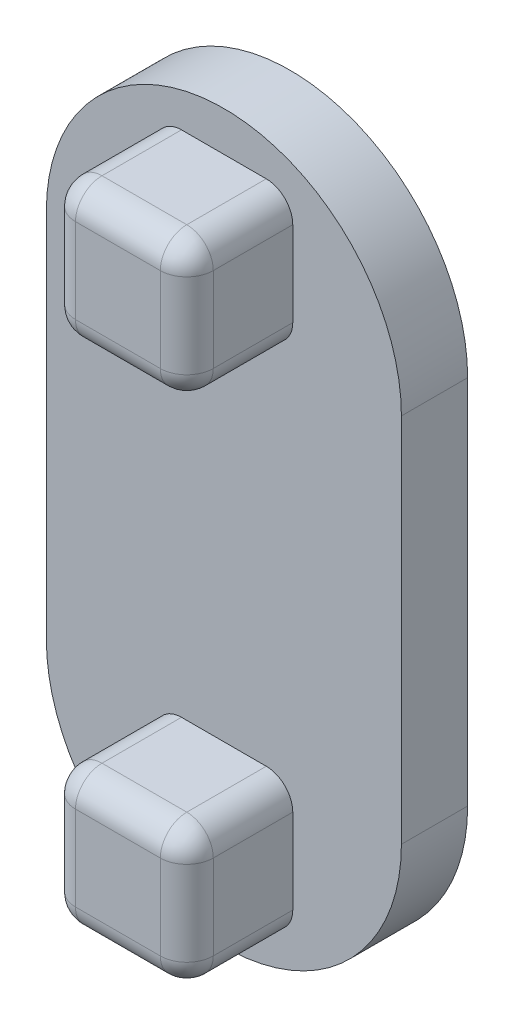
ISO-10303-21;
HEADER;
FILE_DESCRIPTION(('STEP AP214'),'2;1');
FILE_NAME('part.step','',(''),(''),'','','');
FILE_SCHEMA(('AUTOMOTIVE_DESIGN { 1 0 10303 214 1 1 1 1 }'));
ENDSEC;
DATA;
#1=APPLICATION_CONTEXT('core data for automotive mechanical design processes');
#2=APPLICATION_PROTOCOL_DEFINITION('international standard','automotive_design',2000,#1);
#3=PRODUCT_CONTEXT('',#1,'mechanical');
#4=PRODUCT('Part','Part','',(#3));
#5=PRODUCT_RELATED_PRODUCT_CATEGORY('part','',(#4));
#6=PRODUCT_DEFINITION_FORMATION('','',#4);
#7=PRODUCT_DEFINITION_CONTEXT('part definition',#1,'design');
#8=PRODUCT_DEFINITION('design','',#6,#7);
#9=PRODUCT_DEFINITION_SHAPE('','',#8);
#10=(LENGTH_UNIT() NAMED_UNIT(*) SI_UNIT(.MILLI.,.METRE.));
#11=(NAMED_UNIT(*) PLANE_ANGLE_UNIT() SI_UNIT($,.RADIAN.));
#12=(NAMED_UNIT(*) SI_UNIT($,.STERADIAN.) SOLID_ANGLE_UNIT());
#13=UNCERTAINTY_MEASURE_WITH_UNIT(LENGTH_MEASURE(1.E-05),#10,'distance_accuracy_value','');
#14=(GEOMETRIC_REPRESENTATION_CONTEXT(3) GLOBAL_UNCERTAINTY_ASSIGNED_CONTEXT((#13)) GLOBAL_UNIT_ASSIGNED_CONTEXT((#10,
#11,#12)) REPRESENTATION_CONTEXT('',''));
#15=CARTESIAN_POINT('',(0.,0.,0.));
#16=DIRECTION('',(0.,0.,1.));
#17=DIRECTION('',(1.,0.,0.));
#18=AXIS2_PLACEMENT_3D('',#15,#16,#17);
#19=CARTESIAN_POINT('',(0.,0.,2.5));
#20=DIRECTION('',(0.,0.,1.));
#21=DIRECTION('',(1.,0.,0.));
#22=AXIS2_PLACEMENT_3D('',#19,#20,#21);
#23=PLANE('',#22);
#24=CARTESIAN_POINT('',(0.,0.,2.5));
#25=DIRECTION('',(0.,0.,1.));
#26=DIRECTION('',(1.,0.,0.));
#27=AXIS2_PLACEMENT_3D('',#24,#25,#26);
#28=CIRCLE('',#27,6.7);
#29=CARTESIAN_POINT('',(-6.7,0.,2.5));
#30=VERTEX_POINT('',#29);
#31=CARTESIAN_POINT('',(6.7,0.,2.5));
#32=VERTEX_POINT('',#31);
#33=EDGE_CURVE('E220',#30,#32,#28,.T.);
#34=ORIENTED_EDGE('',*,*,#33,.T.);
#35=DIRECTION('',(0.,1.,0.));
#36=VECTOR('',#35,1.);
#37=CARTESIAN_POINT('',(6.7,0.,2.5));
#38=LINE('',#37,#36);
#39=CARTESIAN_POINT('',(6.7,14.,2.5));
#40=VERTEX_POINT('',#39);
#41=EDGE_CURVE('E208',#32,#40,#38,.T.);
#42=ORIENTED_EDGE('',*,*,#41,.T.);
#43=CARTESIAN_POINT('',(0.,14.,2.5));
#44=DIRECTION('',(0.,0.,1.));
#45=DIRECTION('',(1.,0.,0.));
#46=AXIS2_PLACEMENT_3D('',#43,#44,#45);
#47=CIRCLE('',#46,6.7);
#48=CARTESIAN_POINT('',(-6.7,14.,2.5));
#49=VERTEX_POINT('',#48);
#50=EDGE_CURVE('E219',#40,#49,#47,.T.);
#51=ORIENTED_EDGE('',*,*,#50,.T.);
#52=DIRECTION('',(0.,-1.,0.));
#53=VECTOR('',#52,1.);
#54=CARTESIAN_POINT('',(-6.7,0.,2.5));
#55=LINE('',#54,#53);
#56=EDGE_CURVE('E225',#49,#30,#55,.T.);
#57=ORIENTED_EDGE('',*,*,#56,.T.);
#58=EDGE_LOOP('',(#34,#42,#51,#57));
#59=FACE_BOUND('',#58,.T.);
#60=DIRECTION('',(0.,1.,0.));
#61=VECTOR('',#60,1.);
#62=CARTESIAN_POINT('',(2.6,14.,2.5));
#63=LINE('',#62,#61);
#64=CARTESIAN_POINT('',(2.6,15.,2.5));
#65=VERTEX_POINT('',#64);
#66=CARTESIAN_POINT('',(2.6,18.2,2.5));
#67=VERTEX_POINT('',#66);
#68=EDGE_CURVE('E486',#65,#67,#63,.T.);
#69=ORIENTED_EDGE('',*,*,#68,.F.);
#70=CARTESIAN_POINT('',(1.6,15.,2.5));
#71=DIRECTION('',(0.,0.,1.));
#72=DIRECTION('',(1.,0.,0.));
#73=AXIS2_PLACEMENT_3D('',#70,#71,#72);
#74=CIRCLE('',#73,1.);
#75=CARTESIAN_POINT('',(1.6,14.,2.5));
#76=VERTEX_POINT('',#75);
#77=EDGE_CURVE('E340',#65,#76,#74,.F.);
#78=ORIENTED_EDGE('',*,*,#77,.T.);
#79=DIRECTION('',(1.,0.,0.));
#80=VECTOR('',#79,1.);
#81=CARTESIAN_POINT('',(-2.6,14.,2.5));
#82=LINE('',#81,#80);
#83=CARTESIAN_POINT('',(-1.6,14.,2.5));
#84=VERTEX_POINT('',#83);
#85=EDGE_CURVE('E484',#84,#76,#82,.T.);
#86=ORIENTED_EDGE('',*,*,#85,.F.);
#87=CARTESIAN_POINT('',(-1.6,15.,2.5));
#88=DIRECTION('',(0.,0.,1.));
#89=DIRECTION('',(1.,0.,0.));
#90=AXIS2_PLACEMENT_3D('',#87,#88,#89);
#91=CIRCLE('',#90,1.);
#92=CARTESIAN_POINT('',(-2.6,15.,2.5));
#93=VERTEX_POINT('',#92);
#94=EDGE_CURVE('E349',#84,#93,#91,.F.);
#95=ORIENTED_EDGE('',*,*,#94,.T.);
#96=DIRECTION('',(0.,-1.,0.));
#97=VECTOR('',#96,1.);
#98=CARTESIAN_POINT('',(-2.6,14.,2.5));
#99=LINE('',#98,#97);
#100=CARTESIAN_POINT('',(-2.6,18.2,2.5));
#101=VERTEX_POINT('',#100);
#102=EDGE_CURVE('E406',#101,#93,#99,.T.);
#103=ORIENTED_EDGE('',*,*,#102,.F.);
#104=CARTESIAN_POINT('',(-1.6,18.2,2.5));
#105=DIRECTION('',(0.,0.,1.));
#106=DIRECTION('',(1.,0.,0.));
#107=AXIS2_PLACEMENT_3D('',#104,#105,#106);
#108=CIRCLE('',#107,1.);
#109=CARTESIAN_POINT('',(-1.6,19.2,2.5));
#110=VERTEX_POINT('',#109);
#111=EDGE_CURVE('E346',#101,#110,#108,.F.);
#112=ORIENTED_EDGE('',*,*,#111,.T.);
#113=DIRECTION('',(-1.,0.,0.));
#114=VECTOR('',#113,1.);
#115=CARTESIAN_POINT('',(-2.6,19.2,2.5));
#116=LINE('',#115,#114);
#117=CARTESIAN_POINT('',(1.6,19.2,2.5));
#118=VERTEX_POINT('',#117);
#119=EDGE_CURVE('E496',#118,#110,#116,.T.);
#120=ORIENTED_EDGE('',*,*,#119,.F.);
#121=CARTESIAN_POINT('',(1.6,18.2,2.5));
#122=DIRECTION('',(0.,0.,1.));
#123=DIRECTION('',(1.,0.,0.));
#124=AXIS2_PLACEMENT_3D('',#121,#122,#123);
#125=CIRCLE('',#124,1.);
#126=EDGE_CURVE('E343',#118,#67,#125,.F.);
#127=ORIENTED_EDGE('',*,*,#126,.T.);
#128=EDGE_LOOP('',(#69,#78,#86,#95,#103,#112,#120,#127));
#129=FACE_BOUND('',#128,.T.);
#130=DIRECTION('',(1.,0.,0.));
#131=VECTOR('',#130,1.);
#132=CARTESIAN_POINT('',(-2.6,-5.2,2.5));
#133=LINE('',#132,#131);
#134=CARTESIAN_POINT('',(-1.6,-5.2,2.5));
#135=VERTEX_POINT('',#134);
#136=CARTESIAN_POINT('',(1.6,-5.2,2.5));
#137=VERTEX_POINT('',#136);
#138=EDGE_CURVE('E494',#135,#137,#133,.T.);
#139=ORIENTED_EDGE('',*,*,#138,.F.);
#140=CARTESIAN_POINT('',(-1.6,-4.2,2.5));
#141=DIRECTION('',(0.,0.,1.));
#142=DIRECTION('',(1.,0.,0.));
#143=AXIS2_PLACEMENT_3D('',#140,#141,#142);
#144=CIRCLE('',#143,1.);
#145=CARTESIAN_POINT('',(-2.6,-4.2,2.5));
#146=VERTEX_POINT('',#145);
#147=EDGE_CURVE('E11',#135,#146,#144,.F.);
#148=ORIENTED_EDGE('',*,*,#147,.T.);
#149=DIRECTION('',(0.,-1.,0.));
#150=VECTOR('',#149,1.);
#151=CARTESIAN_POINT('',(-2.6,0.,2.5));
#152=LINE('',#151,#150);
#153=CARTESIAN_POINT('',(-2.6,-1.,2.5));
#154=VERTEX_POINT('',#153);
#155=EDGE_CURVE('E489',#154,#146,#152,.T.);
#156=ORIENTED_EDGE('',*,*,#155,.F.);
#157=CARTESIAN_POINT('',(-1.6,-1.,2.5));
#158=DIRECTION('',(0.,0.,1.));
#159=DIRECTION('',(1.,0.,0.));
#160=AXIS2_PLACEMENT_3D('',#157,#158,#159);
#161=CIRCLE('',#160,1.);
#162=CARTESIAN_POINT('',(-1.6,0.,2.5));
#163=VERTEX_POINT('',#162);
#164=EDGE_CURVE('E355',#154,#163,#161,.F.);
#165=ORIENTED_EDGE('',*,*,#164,.T.);
#166=DIRECTION('',(-1.,0.,0.));
#167=VECTOR('',#166,1.);
#168=CARTESIAN_POINT('',(-2.6,0.,2.5));
#169=LINE('',#168,#167);
#170=CARTESIAN_POINT('',(1.6,0.,2.5));
#171=VERTEX_POINT('',#170);
#172=EDGE_CURVE('E508',#171,#163,#169,.T.);
#173=ORIENTED_EDGE('',*,*,#172,.F.);
#174=CARTESIAN_POINT('',(1.6,-1.,2.5));
#175=DIRECTION('',(0.,0.,1.));
#176=DIRECTION('',(1.,0.,0.));
#177=AXIS2_PLACEMENT_3D('',#174,#175,#176);
#178=CIRCLE('',#177,1.);
#179=CARTESIAN_POINT('',(2.6,-1.,2.5));
#180=VERTEX_POINT('',#179);
#181=EDGE_CURVE('E352',#171,#180,#178,.F.);
#182=ORIENTED_EDGE('',*,*,#181,.T.);
#183=DIRECTION('',(0.,1.,0.));
#184=VECTOR('',#183,1.);
#185=CARTESIAN_POINT('',(2.6,0.,2.5));
#186=LINE('',#185,#184);
#187=CARTESIAN_POINT('',(2.6,-4.2,2.5));
#188=VERTEX_POINT('',#187);
#189=EDGE_CURVE('E619',#188,#180,#186,.T.);
#190=ORIENTED_EDGE('',*,*,#189,.F.);
#191=CARTESIAN_POINT('',(1.6,-4.2,2.5));
#192=DIRECTION('',(0.,0.,1.));
#193=DIRECTION('',(1.,0.,0.));
#194=AXIS2_PLACEMENT_3D('',#191,#192,#193);
#195=CIRCLE('',#194,1.);
#196=EDGE_CURVE('E55',#188,#137,#195,.F.);
#197=ORIENTED_EDGE('',*,*,#196,.T.);
#198=EDGE_LOOP('',(#139,#148,#156,#165,#173,#182,#190,#197));
#199=FACE_BOUND('',#198,.T.);
#200=ADVANCED_FACE('F45',(#59,#129,#199),#23,.T.);
#201=CARTESIAN_POINT('',(0.,0.,2.5));
#202=DIRECTION('',(0.,0.,-1.));
#203=DIRECTION('',(-1.,0.,0.));
#204=AXIS2_PLACEMENT_3D('',#201,#202,#203);
#205=CYLINDRICAL_SURFACE('',#204,6.7);
#206=CARTESIAN_POINT('',(0.,0.,0.));
#207=DIRECTION('',(0.,0.,1.));
#208=DIRECTION('',(1.,0.,0.));
#209=AXIS2_PLACEMENT_3D('',#206,#207,#208);
#210=CIRCLE('',#209,6.7);
#211=CARTESIAN_POINT('',(-6.7,0.,0.));
#212=VERTEX_POINT('',#211);
#213=CARTESIAN_POINT('',(6.7,0.,0.));
#214=VERTEX_POINT('',#213);
#215=EDGE_CURVE('E234',#212,#214,#210,.T.);
#216=ORIENTED_EDGE('',*,*,#215,.T.);
#217=DIRECTION('',(0.,0.,-1.));
#218=VECTOR('',#217,1.);
#219=CARTESIAN_POINT('',(6.7,0.,2.5));
#220=LINE('',#219,#218);
#221=EDGE_CURVE('E212',#32,#214,#220,.T.);
#222=ORIENTED_EDGE('',*,*,#221,.F.);
#223=ORIENTED_EDGE('',*,*,#33,.F.);
#224=DIRECTION('',(0.,0.,-1.));
#225=VECTOR('',#224,1.);
#226=CARTESIAN_POINT('',(-6.7,0.,2.5));
#227=LINE('',#226,#225);
#228=EDGE_CURVE('E504',#30,#212,#227,.T.);
#229=ORIENTED_EDGE('',*,*,#228,.T.);
#230=EDGE_LOOP('',(#216,#222,#223,#229));
#231=FACE_BOUND('',#230,.T.);
#232=ADVANCED_FACE('F232',(#231),#205,.T.);
#233=CARTESIAN_POINT('',(6.7,0.,2.5));
#234=DIRECTION('',(-1.,0.,0.));
#235=DIRECTION('',(0.,0.,1.));
#236=AXIS2_PLACEMENT_3D('',#233,#234,#235);
#237=PLANE('',#236);
#238=DIRECTION('',(0.,1.,0.));
#239=VECTOR('',#238,1.);
#240=CARTESIAN_POINT('',(6.7,0.,0.));
#241=LINE('',#240,#239);
#242=CARTESIAN_POINT('',(6.7,14.,0.));
#243=VERTEX_POINT('',#242);
#244=EDGE_CURVE('E507',#214,#243,#241,.T.);
#245=ORIENTED_EDGE('',*,*,#244,.T.);
#246=DIRECTION('',(0.,0.,-1.));
#247=VECTOR('',#246,1.);
#248=CARTESIAN_POINT('',(6.7,14.,2.5));
#249=LINE('',#248,#247);
#250=EDGE_CURVE('E215',#40,#243,#249,.T.);
#251=ORIENTED_EDGE('',*,*,#250,.F.);
#252=ORIENTED_EDGE('',*,*,#41,.F.);
#253=ORIENTED_EDGE('',*,*,#221,.T.);
#254=EDGE_LOOP('',(#245,#251,#252,#253));
#255=FACE_BOUND('',#254,.T.);
#256=ADVANCED_FACE('F210',(#255),#237,.F.);
#257=CARTESIAN_POINT('',(0.,14.,2.5));
#258=DIRECTION('',(0.,0.,-1.));
#259=DIRECTION('',(-1.,0.,0.));
#260=AXIS2_PLACEMENT_3D('',#257,#258,#259);
#261=CYLINDRICAL_SURFACE('',#260,6.7);
#262=CARTESIAN_POINT('',(0.,14.,0.));
#263=DIRECTION('',(0.,0.,1.));
#264=DIRECTION('',(1.,0.,0.));
#265=AXIS2_PLACEMENT_3D('',#262,#263,#264);
#266=CIRCLE('',#265,6.7);
#267=CARTESIAN_POINT('',(-6.7,14.,0.));
#268=VERTEX_POINT('',#267);
#269=EDGE_CURVE('E511',#243,#268,#266,.T.);
#270=ORIENTED_EDGE('',*,*,#269,.T.);
#271=DIRECTION('',(0.,0.,-1.));
#272=VECTOR('',#271,1.);
#273=CARTESIAN_POINT('',(-6.7,14.,2.5));
#274=LINE('',#273,#272);
#275=EDGE_CURVE('E242',#49,#268,#274,.T.);
#276=ORIENTED_EDGE('',*,*,#275,.F.);
#277=ORIENTED_EDGE('',*,*,#50,.F.);
#278=ORIENTED_EDGE('',*,*,#250,.T.);
#279=EDGE_LOOP('',(#270,#276,#277,#278));
#280=FACE_BOUND('',#279,.T.);
#281=ADVANCED_FACE('F527',(#280),#261,.T.);
#282=CARTESIAN_POINT('',(-6.7,0.,2.5));
#283=DIRECTION('',(1.,0.,0.));
#284=DIRECTION('',(0.,0.,-1.));
#285=AXIS2_PLACEMENT_3D('',#282,#283,#284);
#286=PLANE('',#285);
#287=DIRECTION('',(0.,-1.,0.));
#288=VECTOR('',#287,1.);
#289=CARTESIAN_POINT('',(-6.7,0.,0.));
#290=LINE('',#289,#288);
#291=EDGE_CURVE('E230',#268,#212,#290,.T.);
#292=ORIENTED_EDGE('',*,*,#291,.T.);
#293=ORIENTED_EDGE('',*,*,#228,.F.);
#294=ORIENTED_EDGE('',*,*,#56,.F.);
#295=ORIENTED_EDGE('',*,*,#275,.T.);
#296=EDGE_LOOP('',(#292,#293,#294,#295));
#297=FACE_BOUND('',#296,.T.);
#298=ADVANCED_FACE('F522',(#297),#286,.F.);
#299=CARTESIAN_POINT('',(0.,0.,0.));
#300=DIRECTION('',(0.,0.,1.));
#301=DIRECTION('',(1.,0.,0.));
#302=AXIS2_PLACEMENT_3D('',#299,#300,#301);
#303=PLANE('',#302);
#304=ORIENTED_EDGE('',*,*,#215,.F.);
#305=ORIENTED_EDGE('',*,*,#291,.F.);
#306=ORIENTED_EDGE('',*,*,#269,.F.);
#307=ORIENTED_EDGE('',*,*,#244,.F.);
#308=EDGE_LOOP('',(#304,#305,#306,#307));
#309=FACE_BOUND('',#308,.T.);
#310=ADVANCED_FACE('F526',(#309),#303,.F.);
#311=CARTESIAN_POINT('',(-2.6,14.,6.5));
#312=DIRECTION('',(0.,1.,0.));
#313=DIRECTION('',(0.,0.,1.));
#314=AXIS2_PLACEMENT_3D('',#311,#312,#313);
#315=PLANE('',#314);
#316=ORIENTED_EDGE('',*,*,#85,.T.);
#317=DIRECTION('',(0.,0.,-1.));
#318=VECTOR('',#317,1.);
#319=CARTESIAN_POINT('',(1.6,14.,6.5));
#320=LINE('',#319,#318);
#321=CARTESIAN_POINT('',(1.6,14.,5.5));
#322=VERTEX_POINT('',#321);
#323=EDGE_CURVE('E63',#76,#322,#320,.F.);
#324=ORIENTED_EDGE('',*,*,#323,.T.);
#325=DIRECTION('',(1.,0.,0.));
#326=VECTOR('',#325,1.);
#327=CARTESIAN_POINT('',(-2.6,14.,5.5));
#328=LINE('',#327,#326);
#329=CARTESIAN_POINT('',(-1.6,14.,5.5));
#330=VERTEX_POINT('',#329);
#331=EDGE_CURVE('E68',#322,#330,#328,.F.);
#332=ORIENTED_EDGE('',*,*,#331,.T.);
#333=DIRECTION('',(0.,0.,-1.));
#334=VECTOR('',#333,1.);
#335=CARTESIAN_POINT('',(-1.6,14.,6.5));
#336=LINE('',#335,#334);
#337=EDGE_CURVE('E333',#330,#84,#336,.T.);
#338=ORIENTED_EDGE('',*,*,#337,.T.);
#339=EDGE_LOOP('',(#316,#324,#332,#338));
#340=FACE_BOUND('',#339,.T.);
#341=ADVANCED_FACE('F487',(#340),#315,.F.);
#342=CARTESIAN_POINT('',(2.6,14.,6.5));
#343=DIRECTION('',(-1.,0.,0.));
#344=DIRECTION('',(0.,-1.,0.));
#345=AXIS2_PLACEMENT_3D('',#342,#343,#344);
#346=PLANE('',#345);
#347=DIRECTION('',(0.,1.,0.));
#348=VECTOR('',#347,1.);
#349=CARTESIAN_POINT('',(2.6,14.,5.5));
#350=LINE('',#349,#348);
#351=CARTESIAN_POINT('',(2.6,18.2,5.5));
#352=VERTEX_POINT('',#351);
#353=CARTESIAN_POINT('',(2.6,15.,5.5));
#354=VERTEX_POINT('',#353);
#355=EDGE_CURVE('E327',#352,#354,#350,.F.);
#356=ORIENTED_EDGE('',*,*,#355,.T.);
#357=DIRECTION('',(0.,0.,-1.));
#358=VECTOR('',#357,1.);
#359=CARTESIAN_POINT('',(2.6,15.,6.5));
#360=LINE('',#359,#358);
#361=EDGE_CURVE('E330',#354,#65,#360,.T.);
#362=ORIENTED_EDGE('',*,*,#361,.T.);
#363=ORIENTED_EDGE('',*,*,#68,.T.);
#364=DIRECTION('',(0.,0.,-1.));
#365=VECTOR('',#364,1.);
#366=CARTESIAN_POINT('',(2.6,18.2,6.5));
#367=LINE('',#366,#365);
#368=EDGE_CURVE('E324',#67,#352,#367,.F.);
#369=ORIENTED_EDGE('',*,*,#368,.T.);
#370=EDGE_LOOP('',(#356,#362,#363,#369));
#371=FACE_BOUND('',#370,.T.);
#372=ADVANCED_FACE('F475',(#371),#346,.F.);
#373=CARTESIAN_POINT('',(-2.6,19.2,6.5));
#374=DIRECTION('',(0.,-1.,0.));
#375=DIRECTION('',(0.,0.,-1.));
#376=AXIS2_PLACEMENT_3D('',#373,#374,#375);
#377=PLANE('',#376);
#378=DIRECTION('',(-1.,0.,0.));
#379=VECTOR('',#378,1.);
#380=CARTESIAN_POINT('',(2.6,19.2,5.5));
#381=LINE('',#380,#379);
#382=CARTESIAN_POINT('',(-1.6,19.2,5.5));
#383=VERTEX_POINT('',#382);
#384=CARTESIAN_POINT('',(1.6,19.2,5.5));
#385=VERTEX_POINT('',#384);
#386=EDGE_CURVE('E318',#383,#385,#381,.F.);
#387=ORIENTED_EDGE('',*,*,#386,.T.);
#388=DIRECTION('',(0.,0.,-1.));
#389=VECTOR('',#388,1.);
#390=CARTESIAN_POINT('',(1.6,19.2,6.5));
#391=LINE('',#390,#389);
#392=EDGE_CURVE('E321',#385,#118,#391,.T.);
#393=ORIENTED_EDGE('',*,*,#392,.T.);
#394=ORIENTED_EDGE('',*,*,#119,.T.);
#395=DIRECTION('',(0.,0.,-1.));
#396=VECTOR('',#395,1.);
#397=CARTESIAN_POINT('',(-1.6,19.2,6.5));
#398=LINE('',#397,#396);
#399=EDGE_CURVE('E315',#110,#383,#398,.F.);
#400=ORIENTED_EDGE('',*,*,#399,.T.);
#401=EDGE_LOOP('',(#387,#393,#394,#400));
#402=FACE_BOUND('',#401,.T.);
#403=ADVANCED_FACE('F553',(#402),#377,.F.);
#404=CARTESIAN_POINT('',(-2.6,14.,6.5));
#405=DIRECTION('',(1.,0.,0.));
#406=DIRECTION('',(0.,1.,0.));
#407=AXIS2_PLACEMENT_3D('',#404,#405,#406);
#408=PLANE('',#407);
#409=DIRECTION('',(0.,-1.,0.));
#410=VECTOR('',#409,1.);
#411=CARTESIAN_POINT('',(-2.6,19.2,5.5));
#412=LINE('',#411,#410);
#413=CARTESIAN_POINT('',(-2.6,15.,5.5));
#414=VERTEX_POINT('',#413);
#415=CARTESIAN_POINT('',(-2.6,18.2,5.5));
#416=VERTEX_POINT('',#415);
#417=EDGE_CURVE('E308',#414,#416,#412,.F.);
#418=ORIENTED_EDGE('',*,*,#417,.T.);
#419=DIRECTION('',(0.,0.,-1.));
#420=VECTOR('',#419,1.);
#421=CARTESIAN_POINT('',(-2.6,18.2,6.5));
#422=LINE('',#421,#420);
#423=EDGE_CURVE('E312',#416,#101,#422,.T.);
#424=ORIENTED_EDGE('',*,*,#423,.T.);
#425=ORIENTED_EDGE('',*,*,#102,.T.);
#426=DIRECTION('',(0.,0.,-1.));
#427=VECTOR('',#426,1.);
#428=CARTESIAN_POINT('',(-2.6,15.,6.5));
#429=LINE('',#428,#427);
#430=EDGE_CURVE('E305',#93,#414,#429,.F.);
#431=ORIENTED_EDGE('',*,*,#430,.T.);
#432=EDGE_LOOP('',(#418,#424,#425,#431));
#433=FACE_BOUND('',#432,.T.);
#434=ADVANCED_FACE('F560',(#433),#408,.F.);
#435=CARTESIAN_POINT('',(0.,0.,6.5));
#436=DIRECTION('',(0.,0.,1.));
#437=DIRECTION('',(1.,0.,0.));
#438=AXIS2_PLACEMENT_3D('',#435,#436,#437);
#439=PLANE('',#438);
#440=DIRECTION('',(-1.,0.,0.));
#441=VECTOR('',#440,1.);
#442=CARTESIAN_POINT('',(-2.6,18.2,6.5));
#443=LINE('',#442,#441);
#444=CARTESIAN_POINT('',(1.6,18.2,6.5));
#445=VERTEX_POINT('',#444);
#446=CARTESIAN_POINT('',(-1.6,18.2,6.5));
#447=VERTEX_POINT('',#446);
#448=EDGE_CURVE('E298',#445,#447,#443,.T.);
#449=ORIENTED_EDGE('',*,*,#448,.T.);
#450=DIRECTION('',(0.,-1.,0.));
#451=VECTOR('',#450,1.);
#452=CARTESIAN_POINT('',(-1.6,14.,6.5));
#453=LINE('',#452,#451);
#454=CARTESIAN_POINT('',(-1.6,15.,6.5));
#455=VERTEX_POINT('',#454);
#456=EDGE_CURVE('E301',#447,#455,#453,.T.);
#457=ORIENTED_EDGE('',*,*,#456,.T.);
#458=DIRECTION('',(1.,0.,0.));
#459=VECTOR('',#458,1.);
#460=CARTESIAN_POINT('',(2.6,15.,6.5));
#461=LINE('',#460,#459);
#462=CARTESIAN_POINT('',(1.6,15.,6.5));
#463=VERTEX_POINT('',#462);
#464=EDGE_CURVE('E292',#455,#463,#461,.T.);
#465=ORIENTED_EDGE('',*,*,#464,.T.);
#466=DIRECTION('',(0.,1.,0.));
#467=VECTOR('',#466,1.);
#468=CARTESIAN_POINT('',(1.6,19.2,6.5));
#469=LINE('',#468,#467);
#470=EDGE_CURVE('E295',#463,#445,#469,.T.);
#471=ORIENTED_EDGE('',*,*,#470,.T.);
#472=EDGE_LOOP('',(#449,#457,#465,#471));
#473=FACE_BOUND('',#472,.T.);
#474=ADVANCED_FACE('F465',(#473),#439,.T.);
#475=CARTESIAN_POINT('',(-2.6,0.,6.5));
#476=DIRECTION('',(1.,0.,0.));
#477=DIRECTION('',(0.,1.,0.));
#478=AXIS2_PLACEMENT_3D('',#475,#476,#477);
#479=PLANE('',#478);
#480=DIRECTION('',(0.,-1.,0.));
#481=VECTOR('',#480,1.);
#482=CARTESIAN_POINT('',(-2.6,0.,5.5));
#483=LINE('',#482,#481);
#484=CARTESIAN_POINT('',(-2.6,-4.2,5.5));
#485=VERTEX_POINT('',#484);
#486=CARTESIAN_POINT('',(-2.6,-1.,5.5));
#487=VERTEX_POINT('',#486);
#488=EDGE_CURVE('E286',#485,#487,#483,.F.);
#489=ORIENTED_EDGE('',*,*,#488,.T.);
#490=DIRECTION('',(0.,0.,-1.));
#491=VECTOR('',#490,1.);
#492=CARTESIAN_POINT('',(-2.6,-1.,6.5));
#493=LINE('',#492,#491);
#494=EDGE_CURVE('E289',#487,#154,#493,.T.);
#495=ORIENTED_EDGE('',*,*,#494,.T.);
#496=ORIENTED_EDGE('',*,*,#155,.T.);
#497=DIRECTION('',(0.,0.,-1.));
#498=VECTOR('',#497,1.);
#499=CARTESIAN_POINT('',(-2.6,-4.2,6.5));
#500=LINE('',#499,#498);
#501=EDGE_CURVE('E283',#146,#485,#500,.F.);
#502=ORIENTED_EDGE('',*,*,#501,.T.);
#503=EDGE_LOOP('',(#489,#495,#496,#502));
#504=FACE_BOUND('',#503,.T.);
#505=ADVANCED_FACE('F556',(#504),#479,.F.);
#506=CARTESIAN_POINT('',(-2.6,-5.2,6.5));
#507=DIRECTION('',(0.,1.,0.));
#508=DIRECTION('',(0.,0.,1.));
#509=AXIS2_PLACEMENT_3D('',#506,#507,#508);
#510=PLANE('',#509);
#511=ORIENTED_EDGE('',*,*,#138,.T.);
#512=DIRECTION('',(0.,0.,-1.));
#513=VECTOR('',#512,1.);
#514=CARTESIAN_POINT('',(1.6,-5.2,6.5));
#515=LINE('',#514,#513);
#516=CARTESIAN_POINT('',(1.6,-5.2,5.5));
#517=VERTEX_POINT('',#516);
#518=EDGE_CURVE('E280',#137,#517,#515,.F.);
#519=ORIENTED_EDGE('',*,*,#518,.T.);
#520=DIRECTION('',(1.,0.,0.));
#521=VECTOR('',#520,1.);
#522=CARTESIAN_POINT('',(-2.6,-5.2,5.5));
#523=LINE('',#522,#521);
#524=CARTESIAN_POINT('',(-1.6,-5.2,5.5));
#525=VERTEX_POINT('',#524);
#526=EDGE_CURVE('E277',#517,#525,#523,.F.);
#527=ORIENTED_EDGE('',*,*,#526,.T.);
#528=DIRECTION('',(0.,0.,-1.));
#529=VECTOR('',#528,1.);
#530=CARTESIAN_POINT('',(-1.6,-5.2,6.5));
#531=LINE('',#530,#529);
#532=EDGE_CURVE('E274',#525,#135,#531,.T.);
#533=ORIENTED_EDGE('',*,*,#532,.T.);
#534=EDGE_LOOP('',(#511,#519,#527,#533));
#535=FACE_BOUND('',#534,.T.);
#536=ADVANCED_FACE('F628',(#535),#510,.F.);
#537=CARTESIAN_POINT('',(2.6,0.,6.5));
#538=DIRECTION('',(-1.,0.,0.));
#539=DIRECTION('',(0.,-1.,0.));
#540=AXIS2_PLACEMENT_3D('',#537,#538,#539);
#541=PLANE('',#540);
#542=ORIENTED_EDGE('',*,*,#189,.T.);
#543=DIRECTION('',(0.,0.,-1.));
#544=VECTOR('',#543,1.);
#545=CARTESIAN_POINT('',(2.6,-1.,6.5));
#546=LINE('',#545,#544);
#547=CARTESIAN_POINT('',(2.6,-1.,5.5));
#548=VERTEX_POINT('',#547);
#549=EDGE_CURVE('E271',#180,#548,#546,.F.);
#550=ORIENTED_EDGE('',*,*,#549,.T.);
#551=DIRECTION('',(0.,1.,0.));
#552=VECTOR('',#551,1.);
#553=CARTESIAN_POINT('',(2.6,-5.2,5.5));
#554=LINE('',#553,#552);
#555=CARTESIAN_POINT('',(2.6,-4.2,5.5));
#556=VERTEX_POINT('',#555);
#557=EDGE_CURVE('E268',#548,#556,#554,.F.);
#558=ORIENTED_EDGE('',*,*,#557,.T.);
#559=DIRECTION('',(0.,0.,-1.));
#560=VECTOR('',#559,1.);
#561=CARTESIAN_POINT('',(2.6,-4.2,6.5));
#562=LINE('',#561,#560);
#563=EDGE_CURVE('E265',#556,#188,#562,.T.);
#564=ORIENTED_EDGE('',*,*,#563,.T.);
#565=EDGE_LOOP('',(#542,#550,#558,#564));
#566=FACE_BOUND('',#565,.T.);
#567=ADVANCED_FACE('F681',(#566),#541,.F.);
#568=CARTESIAN_POINT('',(-2.6,0.,6.5));
#569=DIRECTION('',(0.,-1.,0.));
#570=DIRECTION('',(0.,0.,-1.));
#571=AXIS2_PLACEMENT_3D('',#568,#569,#570);
#572=PLANE('',#571);
#573=DIRECTION('',(-1.,0.,0.));
#574=VECTOR('',#573,1.);
#575=CARTESIAN_POINT('',(2.6,0.,5.5));
#576=LINE('',#575,#574);
#577=CARTESIAN_POINT('',(-1.6,0.,5.5));
#578=VERTEX_POINT('',#577);
#579=CARTESIAN_POINT('',(1.6,0.,5.5));
#580=VERTEX_POINT('',#579);
#581=EDGE_CURVE('E258',#578,#580,#576,.F.);
#582=ORIENTED_EDGE('',*,*,#581,.T.);
#583=DIRECTION('',(0.,0.,-1.));
#584=VECTOR('',#583,1.);
#585=CARTESIAN_POINT('',(1.6,0.,6.5));
#586=LINE('',#585,#584);
#587=EDGE_CURVE('E262',#580,#171,#586,.T.);
#588=ORIENTED_EDGE('',*,*,#587,.T.);
#589=ORIENTED_EDGE('',*,*,#172,.T.);
#590=DIRECTION('',(0.,0.,-1.));
#591=VECTOR('',#590,1.);
#592=CARTESIAN_POINT('',(-1.6,0.,6.5));
#593=LINE('',#592,#591);
#594=EDGE_CURVE('E255',#163,#578,#593,.F.);
#595=ORIENTED_EDGE('',*,*,#594,.T.);
#596=EDGE_LOOP('',(#582,#588,#589,#595));
#597=FACE_BOUND('',#596,.T.);
#598=ADVANCED_FACE('F670',(#597),#572,.F.);
#599=CARTESIAN_POINT('',(0.,0.,6.5));
#600=DIRECTION('',(0.,0.,1.));
#601=DIRECTION('',(1.,0.,0.));
#602=AXIS2_PLACEMENT_3D('',#599,#600,#601);
#603=PLANE('',#602);
#604=DIRECTION('',(0.,1.,0.));
#605=VECTOR('',#604,1.);
#606=CARTESIAN_POINT('',(1.6,0.,6.5));
#607=LINE('',#606,#605);
#608=CARTESIAN_POINT('',(1.6,-4.2,6.5));
#609=VERTEX_POINT('',#608);
#610=CARTESIAN_POINT('',(1.6,-1.,6.5));
#611=VERTEX_POINT('',#610);
#612=EDGE_CURVE('E248',#609,#611,#607,.T.);
#613=ORIENTED_EDGE('',*,*,#612,.T.);
#614=DIRECTION('',(-1.,0.,0.));
#615=VECTOR('',#614,1.);
#616=CARTESIAN_POINT('',(-2.6,-1.,6.5));
#617=LINE('',#616,#615);
#618=CARTESIAN_POINT('',(-1.6,-1.,6.5));
#619=VERTEX_POINT('',#618);
#620=EDGE_CURVE('E251',#611,#619,#617,.T.);
#621=ORIENTED_EDGE('',*,*,#620,.T.);
#622=DIRECTION('',(0.,-1.,0.));
#623=VECTOR('',#622,1.);
#624=CARTESIAN_POINT('',(-1.6,-5.2,6.5));
#625=LINE('',#624,#623);
#626=CARTESIAN_POINT('',(-1.6,-4.2,6.5));
#627=VERTEX_POINT('',#626);
#628=EDGE_CURVE('E236',#619,#627,#625,.T.);
#629=ORIENTED_EDGE('',*,*,#628,.T.);
#630=DIRECTION('',(1.,0.,0.));
#631=VECTOR('',#630,1.);
#632=CARTESIAN_POINT('',(2.6,-4.2,6.5));
#633=LINE('',#632,#631);
#634=EDGE_CURVE('E240',#627,#609,#633,.T.);
#635=ORIENTED_EDGE('',*,*,#634,.T.);
#636=EDGE_LOOP('',(#613,#621,#629,#635));
#637=FACE_BOUND('',#636,.T.);
#638=ADVANCED_FACE('F686',(#637),#603,.T.);
#639=CARTESIAN_POINT('',(1.6,-4.2,6.5));
#640=DIRECTION('',(0.,0.,-1.));
#641=DIRECTION('',(-1.,0.,0.));
#642=AXIS2_PLACEMENT_3D('',#639,#640,#641);
#643=CYLINDRICAL_SURFACE('',#642,1.);
#644=ORIENTED_EDGE('',*,*,#196,.F.);
#645=ORIENTED_EDGE('',*,*,#563,.F.);
#646=CARTESIAN_POINT('',(1.6,-4.2,5.5));
#647=DIRECTION('',(0.,0.,1.));
#648=DIRECTION('',(1.,0.,0.));
#649=AXIS2_PLACEMENT_3D('',#646,#647,#648);
#650=CIRCLE('',#649,1.);
#651=EDGE_CURVE('E402',#517,#556,#650,.T.);
#652=ORIENTED_EDGE('',*,*,#651,.F.);
#653=ORIENTED_EDGE('',*,*,#518,.F.);
#654=EDGE_LOOP('',(#644,#645,#652,#653));
#655=FACE_BOUND('',#654,.T.);
#656=ADVANCED_FACE('F635',(#655),#643,.T.);
#657=CARTESIAN_POINT('',(0.,-4.2,5.5));
#658=DIRECTION('',(-1.,0.,0.));
#659=DIRECTION('',(0.,0.,1.));
#660=AXIS2_PLACEMENT_3D('',#657,#658,#659);
#661=CYLINDRICAL_SURFACE('',#660,1.);
#662=CARTESIAN_POINT('',(-1.6,-4.2,5.5));
#663=DIRECTION('',(-1.,0.,0.));
#664=DIRECTION('',(0.,0.,1.));
#665=AXIS2_PLACEMENT_3D('',#662,#663,#664);
#666=CIRCLE('',#665,1.);
#667=EDGE_CURVE('E394',#525,#627,#666,.T.);
#668=ORIENTED_EDGE('',*,*,#667,.F.);
#669=ORIENTED_EDGE('',*,*,#526,.F.);
#670=CARTESIAN_POINT('',(1.6,-4.2,5.5));
#671=DIRECTION('',(1.,0.,0.));
#672=DIRECTION('',(0.,0.,-1.));
#673=AXIS2_PLACEMENT_3D('',#670,#671,#672);
#674=CIRCLE('',#673,1.);
#675=EDGE_CURVE('E398',#609,#517,#674,.T.);
#676=ORIENTED_EDGE('',*,*,#675,.F.);
#677=ORIENTED_EDGE('',*,*,#634,.F.);
#678=EDGE_LOOP('',(#668,#669,#676,#677));
#679=FACE_BOUND('',#678,.T.);
#680=ADVANCED_FACE('F645',(#679),#661,.T.);
#681=CARTESIAN_POINT('',(-1.6,-4.2,6.5));
#682=DIRECTION('',(0.,0.,-1.));
#683=DIRECTION('',(-1.,0.,0.));
#684=AXIS2_PLACEMENT_3D('',#681,#682,#683);
#685=CYLINDRICAL_SURFACE('',#684,1.);
#686=ORIENTED_EDGE('',*,*,#147,.F.);
#687=ORIENTED_EDGE('',*,*,#532,.F.);
#688=CARTESIAN_POINT('',(-1.6,-4.2,5.5));
#689=DIRECTION('',(0.,0.,1.));
#690=DIRECTION('',(1.,0.,0.));
#691=AXIS2_PLACEMENT_3D('',#688,#689,#690);
#692=CIRCLE('',#691,1.);
#693=EDGE_CURVE('E390',#485,#525,#692,.T.);
#694=ORIENTED_EDGE('',*,*,#693,.F.);
#695=ORIENTED_EDGE('',*,*,#501,.F.);
#696=EDGE_LOOP('',(#686,#687,#694,#695));
#697=FACE_BOUND('',#696,.T.);
#698=ADVANCED_FACE('F648',(#697),#685,.T.);
#699=CARTESIAN_POINT('',(1.6,-4.2,5.5));
#700=DIRECTION('',(0.,-1.,0.));
#701=DIRECTION('',(0.,0.,-1.));
#702=AXIS2_PLACEMENT_3D('',#699,#700,#701);
#703=SPHERICAL_SURFACE('',#702,1.);
#704=ORIENTED_EDGE('',*,*,#675,.T.);
#705=ORIENTED_EDGE('',*,*,#651,.T.);
#706=CARTESIAN_POINT('',(1.6,-4.2,5.5));
#707=DIRECTION('',(0.,-1.,0.));
#708=DIRECTION('',(0.,0.,-1.));
#709=AXIS2_PLACEMENT_3D('',#706,#707,#708);
#710=CIRCLE('',#709,1.);
#711=EDGE_CURVE('E386',#609,#556,#710,.F.);
#712=ORIENTED_EDGE('',*,*,#711,.F.);
#713=EDGE_LOOP('',(#704,#705,#712));
#714=FACE_BOUND('',#713,.T.);
#715=ADVANCED_FACE('F640',(#714),#703,.T.);
#716=CARTESIAN_POINT('',(-1.6,-4.2,5.5));
#717=DIRECTION('',(0.,-1.,0.));
#718=DIRECTION('',(0.,0.,-1.));
#719=AXIS2_PLACEMENT_3D('',#716,#717,#718);
#720=SPHERICAL_SURFACE('',#719,1.);
#721=ORIENTED_EDGE('',*,*,#693,.T.);
#722=ORIENTED_EDGE('',*,*,#667,.T.);
#723=CARTESIAN_POINT('',(-1.6,-4.2,5.5));
#724=DIRECTION('',(0.,-1.,0.));
#725=DIRECTION('',(0.,0.,-1.));
#726=AXIS2_PLACEMENT_3D('',#723,#724,#725);
#727=CIRCLE('',#726,1.);
#728=EDGE_CURVE('E382',#485,#627,#727,.F.);
#729=ORIENTED_EDGE('',*,*,#728,.F.);
#730=EDGE_LOOP('',(#721,#722,#729));
#731=FACE_BOUND('',#730,.T.);
#732=ADVANCED_FACE('F805',(#731),#720,.T.);
#733=CARTESIAN_POINT('',(1.6,-1.,6.5));
#734=DIRECTION('',(0.,0.,-1.));
#735=DIRECTION('',(-1.,0.,0.));
#736=AXIS2_PLACEMENT_3D('',#733,#734,#735);
#737=CYLINDRICAL_SURFACE('',#736,1.);
#738=ORIENTED_EDGE('',*,*,#181,.F.);
#739=ORIENTED_EDGE('',*,*,#587,.F.);
#740=CARTESIAN_POINT('',(1.6,-1.,5.5));
#741=DIRECTION('',(0.,0.,1.));
#742=DIRECTION('',(1.,0.,0.));
#743=AXIS2_PLACEMENT_3D('',#740,#741,#742);
#744=CIRCLE('',#743,1.);
#745=EDGE_CURVE('E378',#548,#580,#744,.T.);
#746=ORIENTED_EDGE('',*,*,#745,.F.);
#747=ORIENTED_EDGE('',*,*,#549,.F.);
#748=EDGE_LOOP('',(#738,#739,#746,#747));
#749=FACE_BOUND('',#748,.T.);
#750=ADVANCED_FACE('F677',(#749),#737,.T.);
#751=CARTESIAN_POINT('',(1.6,0.,5.5));
#752=DIRECTION('',(0.,-1.,0.));
#753=DIRECTION('',(1.,0.,0.));
#754=AXIS2_PLACEMENT_3D('',#751,#752,#753);
#755=CYLINDRICAL_SURFACE('',#754,1.);
#756=ORIENTED_EDGE('',*,*,#711,.T.);
#757=ORIENTED_EDGE('',*,*,#557,.F.);
#758=CARTESIAN_POINT('',(1.6,-1.,5.5));
#759=DIRECTION('',(0.,1.,0.));
#760=DIRECTION('',(-1.,0.,0.));
#761=AXIS2_PLACEMENT_3D('',#758,#759,#760);
#762=CIRCLE('',#761,1.);
#763=EDGE_CURVE('E374',#611,#548,#762,.T.);
#764=ORIENTED_EDGE('',*,*,#763,.F.);
#765=ORIENTED_EDGE('',*,*,#612,.F.);
#766=EDGE_LOOP('',(#756,#757,#764,#765));
#767=FACE_BOUND('',#766,.T.);
#768=ADVANCED_FACE('F684',(#767),#755,.T.);
#769=CARTESIAN_POINT('',(-1.6,0.,5.5));
#770=DIRECTION('',(0.,1.,0.));
#771=DIRECTION('',(-1.,0.,0.));
#772=AXIS2_PLACEMENT_3D('',#769,#770,#771);
#773=CYLINDRICAL_SURFACE('',#772,1.);
#774=ORIENTED_EDGE('',*,*,#728,.T.);
#775=ORIENTED_EDGE('',*,*,#628,.F.);
#776=CARTESIAN_POINT('',(-1.6,-1.,5.5));
#777=DIRECTION('',(0.,1.,0.));
#778=DIRECTION('',(0.,0.,1.));
#779=AXIS2_PLACEMENT_3D('',#776,#777,#778);
#780=CIRCLE('',#779,1.);
#781=EDGE_CURVE('E370',#487,#619,#780,.T.);
#782=ORIENTED_EDGE('',*,*,#781,.F.);
#783=ORIENTED_EDGE('',*,*,#488,.F.);
#784=EDGE_LOOP('',(#774,#775,#782,#783));
#785=FACE_BOUND('',#784,.T.);
#786=ADVANCED_FACE('F664',(#785),#773,.T.);
#787=CARTESIAN_POINT('',(-1.6,-1.,6.5));
#788=DIRECTION('',(0.,0.,-1.));
#789=DIRECTION('',(-1.,0.,0.));
#790=AXIS2_PLACEMENT_3D('',#787,#788,#789);
#791=CYLINDRICAL_SURFACE('',#790,1.);
#792=ORIENTED_EDGE('',*,*,#164,.F.);
#793=ORIENTED_EDGE('',*,*,#494,.F.);
#794=CARTESIAN_POINT('',(-1.6,-1.,5.5));
#795=DIRECTION('',(0.,0.,1.));
#796=DIRECTION('',(1.,0.,0.));
#797=AXIS2_PLACEMENT_3D('',#794,#795,#796);
#798=CIRCLE('',#797,1.);
#799=EDGE_CURVE('E366',#578,#487,#798,.T.);
#800=ORIENTED_EDGE('',*,*,#799,.F.);
#801=ORIENTED_EDGE('',*,*,#594,.F.);
#802=EDGE_LOOP('',(#792,#793,#800,#801));
#803=FACE_BOUND('',#802,.T.);
#804=ADVANCED_FACE('F659',(#803),#791,.T.);
#805=CARTESIAN_POINT('',(1.6,-1.,5.5));
#806=DIRECTION('',(1.,0.,0.));
#807=DIRECTION('',(0.,1.,0.));
#808=AXIS2_PLACEMENT_3D('',#805,#806,#807);
#809=SPHERICAL_SURFACE('',#808,1.);
#810=ORIENTED_EDGE('',*,*,#763,.T.);
#811=ORIENTED_EDGE('',*,*,#745,.T.);
#812=CARTESIAN_POINT('',(1.6,-1.,5.5));
#813=DIRECTION('',(1.,0.,0.));
#814=DIRECTION('',(0.,0.,-1.));
#815=AXIS2_PLACEMENT_3D('',#812,#813,#814);
#816=CIRCLE('',#815,1.);
#817=EDGE_CURVE('E363',#611,#580,#816,.F.);
#818=ORIENTED_EDGE('',*,*,#817,.F.);
#819=EDGE_LOOP('',(#810,#811,#818));
#820=FACE_BOUND('',#819,.T.);
#821=ADVANCED_FACE('F842',(#820),#809,.T.);
#822=CARTESIAN_POINT('',(-1.6,-1.,5.5));
#823=DIRECTION('',(-1.,0.,0.));
#824=DIRECTION('',(0.,0.,1.));
#825=AXIS2_PLACEMENT_3D('',#822,#823,#824);
#826=SPHERICAL_SURFACE('',#825,1.);
#827=ORIENTED_EDGE('',*,*,#799,.T.);
#828=ORIENTED_EDGE('',*,*,#781,.T.);
#829=CARTESIAN_POINT('',(-1.6,-1.,5.5));
#830=DIRECTION('',(-1.,0.,0.));
#831=DIRECTION('',(0.,0.,1.));
#832=AXIS2_PLACEMENT_3D('',#829,#830,#831);
#833=CIRCLE('',#832,1.);
#834=EDGE_CURVE('E360',#578,#619,#833,.F.);
#835=ORIENTED_EDGE('',*,*,#834,.F.);
#836=EDGE_LOOP('',(#827,#828,#835));
#837=FACE_BOUND('',#836,.T.);
#838=ADVANCED_FACE('F604',(#837),#826,.T.);
#839=CARTESIAN_POINT('',(0.,-1.,5.5));
#840=DIRECTION('',(1.,0.,0.));
#841=DIRECTION('',(0.,0.,-1.));
#842=AXIS2_PLACEMENT_3D('',#839,#840,#841);
#843=CYLINDRICAL_SURFACE('',#842,1.);
#844=ORIENTED_EDGE('',*,*,#817,.T.);
#845=ORIENTED_EDGE('',*,*,#581,.F.);
#846=ORIENTED_EDGE('',*,*,#834,.T.);
#847=ORIENTED_EDGE('',*,*,#620,.F.);
#848=EDGE_LOOP('',(#844,#845,#846,#847));
#849=FACE_BOUND('',#848,.T.);
#850=ADVANCED_FACE('F600',(#849),#843,.T.);
#851=CARTESIAN_POINT('',(1.6,18.2,6.5));
#852=DIRECTION('',(0.,0.,-1.));
#853=DIRECTION('',(-1.,0.,0.));
#854=AXIS2_PLACEMENT_3D('',#851,#852,#853);
#855=CYLINDRICAL_SURFACE('',#854,1.);
#856=ORIENTED_EDGE('',*,*,#126,.F.);
#857=ORIENTED_EDGE('',*,*,#392,.F.);
#858=CARTESIAN_POINT('',(1.6,18.2,5.5));
#859=DIRECTION('',(0.,0.,1.));
#860=DIRECTION('',(1.,0.,0.));
#861=AXIS2_PLACEMENT_3D('',#858,#859,#860);
#862=CIRCLE('',#861,1.);
#863=EDGE_CURVE('E49',#352,#385,#862,.T.);
#864=ORIENTED_EDGE('',*,*,#863,.F.);
#865=ORIENTED_EDGE('',*,*,#368,.F.);
#866=EDGE_LOOP('',(#856,#857,#864,#865));
#867=FACE_BOUND('',#866,.T.);
#868=ADVANCED_FACE('F47',(#867),#855,.T.);
#869=CARTESIAN_POINT('',(1.6,0.,5.5));
#870=DIRECTION('',(0.,-1.,0.));
#871=DIRECTION('',(1.,0.,0.));
#872=AXIS2_PLACEMENT_3D('',#869,#870,#871);
#873=CYLINDRICAL_SURFACE('',#872,1.);
#874=CARTESIAN_POINT('',(1.6,15.,5.5));
#875=DIRECTION('',(0.,-1.,0.));
#876=DIRECTION('',(0.,0.,-1.));
#877=AXIS2_PLACEMENT_3D('',#874,#875,#876);
#878=CIRCLE('',#877,1.);
#879=EDGE_CURVE('E441',#354,#463,#878,.T.);
#880=ORIENTED_EDGE('',*,*,#879,.F.);
#881=ORIENTED_EDGE('',*,*,#355,.F.);
#882=CARTESIAN_POINT('',(1.6,18.2,5.5));
#883=DIRECTION('',(0.,1.,0.));
#884=DIRECTION('',(0.,0.,1.));
#885=AXIS2_PLACEMENT_3D('',#882,#883,#884);
#886=CIRCLE('',#885,1.);
#887=EDGE_CURVE('E444',#445,#352,#886,.T.);
#888=ORIENTED_EDGE('',*,*,#887,.F.);
#889=ORIENTED_EDGE('',*,*,#470,.F.);
#890=EDGE_LOOP('',(#880,#881,#888,#889));
#891=FACE_BOUND('',#890,.T.);
#892=ADVANCED_FACE('F472',(#891),#873,.T.);
#893=CARTESIAN_POINT('',(1.6,15.,6.5));
#894=DIRECTION('',(0.,0.,-1.));
#895=DIRECTION('',(-1.,0.,0.));
#896=AXIS2_PLACEMENT_3D('',#893,#894,#895);
#897=CYLINDRICAL_SURFACE('',#896,1.);
#898=ORIENTED_EDGE('',*,*,#77,.F.);
#899=ORIENTED_EDGE('',*,*,#361,.F.);
#900=CARTESIAN_POINT('',(1.6,15.,5.5));
#901=DIRECTION('',(0.,0.,1.));
#902=DIRECTION('',(1.,0.,0.));
#903=AXIS2_PLACEMENT_3D('',#900,#901,#902);
#904=CIRCLE('',#903,1.);
#905=EDGE_CURVE('E437',#322,#354,#904,.T.);
#906=ORIENTED_EDGE('',*,*,#905,.F.);
#907=ORIENTED_EDGE('',*,*,#323,.F.);
#908=EDGE_LOOP('',(#898,#899,#906,#907));
#909=FACE_BOUND('',#908,.T.);
#910=ADVANCED_FACE('F480',(#909),#897,.T.);
#911=CARTESIAN_POINT('',(1.6,18.2,5.5));
#912=DIRECTION('',(1.,0.,0.));
#913=DIRECTION('',(0.,0.,-1.));
#914=AXIS2_PLACEMENT_3D('',#911,#912,#913);
#915=SPHERICAL_SURFACE('',#914,1.);
#916=ORIENTED_EDGE('',*,*,#887,.T.);
#917=ORIENTED_EDGE('',*,*,#863,.T.);
#918=CARTESIAN_POINT('',(1.6,18.2,5.5));
#919=DIRECTION('',(1.,0.,0.));
#920=DIRECTION('',(0.,0.,-1.));
#921=AXIS2_PLACEMENT_3D('',#918,#919,#920);
#922=CIRCLE('',#921,1.);
#923=EDGE_CURVE('E433',#445,#385,#922,.F.);
#924=ORIENTED_EDGE('',*,*,#923,.F.);
#925=EDGE_LOOP('',(#916,#917,#924));
#926=FACE_BOUND('',#925,.T.);
#927=ADVANCED_FACE('F453',(#926),#915,.T.);
#928=CARTESIAN_POINT('',(1.6,15.,5.5));
#929=DIRECTION('',(1.,0.,0.));
#930=DIRECTION('',(0.,0.,-1.));
#931=AXIS2_PLACEMENT_3D('',#928,#929,#930);
#932=SPHERICAL_SURFACE('',#931,1.);
#933=ORIENTED_EDGE('',*,*,#905,.T.);
#934=ORIENTED_EDGE('',*,*,#879,.T.);
#935=CARTESIAN_POINT('',(1.6,15.,5.5));
#936=DIRECTION('',(1.,0.,0.));
#937=DIRECTION('',(0.,0.,-1.));
#938=AXIS2_PLACEMENT_3D('',#935,#936,#937);
#939=CIRCLE('',#938,1.);
#940=EDGE_CURVE('E429',#322,#463,#939,.F.);
#941=ORIENTED_EDGE('',*,*,#940,.F.);
#942=EDGE_LOOP('',(#933,#934,#941));
#943=FACE_BOUND('',#942,.T.);
#944=ADVANCED_FACE('F582',(#943),#932,.T.);
#945=CARTESIAN_POINT('',(-1.6,18.2,6.5));
#946=DIRECTION('',(0.,0.,-1.));
#947=DIRECTION('',(-1.,0.,0.));
#948=AXIS2_PLACEMENT_3D('',#945,#946,#947);
#949=CYLINDRICAL_SURFACE('',#948,1.);
#950=ORIENTED_EDGE('',*,*,#111,.F.);
#951=ORIENTED_EDGE('',*,*,#423,.F.);
#952=CARTESIAN_POINT('',(-1.6,18.2,5.5));
#953=DIRECTION('',(0.,0.,1.));
#954=DIRECTION('',(1.,0.,0.));
#955=AXIS2_PLACEMENT_3D('',#952,#953,#954);
#956=CIRCLE('',#955,1.);
#957=EDGE_CURVE('E425',#383,#416,#956,.T.);
#958=ORIENTED_EDGE('',*,*,#957,.F.);
#959=ORIENTED_EDGE('',*,*,#399,.F.);
#960=EDGE_LOOP('',(#950,#951,#958,#959));
#961=FACE_BOUND('',#960,.T.);
#962=ADVANCED_FACE('F584',(#961),#949,.T.);
#963=CARTESIAN_POINT('',(0.,18.2,5.5));
#964=DIRECTION('',(1.,0.,0.));
#965=DIRECTION('',(0.,0.,-1.));
#966=AXIS2_PLACEMENT_3D('',#963,#964,#965);
#967=CYLINDRICAL_SURFACE('',#966,1.);
#968=ORIENTED_EDGE('',*,*,#923,.T.);
#969=ORIENTED_EDGE('',*,*,#386,.F.);
#970=CARTESIAN_POINT('',(-1.6,18.2,5.5));
#971=DIRECTION('',(-1.,0.,0.));
#972=DIRECTION('',(0.,0.,1.));
#973=AXIS2_PLACEMENT_3D('',#970,#971,#972);
#974=CIRCLE('',#973,1.);
#975=EDGE_CURVE('E421',#447,#383,#974,.T.);
#976=ORIENTED_EDGE('',*,*,#975,.F.);
#977=ORIENTED_EDGE('',*,*,#448,.F.);
#978=EDGE_LOOP('',(#968,#969,#976,#977));
#979=FACE_BOUND('',#978,.T.);
#980=ADVANCED_FACE('F460',(#979),#967,.T.);
#981=CARTESIAN_POINT('',(0.,15.,5.5));
#982=DIRECTION('',(-1.,0.,0.));
#983=DIRECTION('',(0.,0.,1.));
#984=AXIS2_PLACEMENT_3D('',#981,#982,#983);
#985=CYLINDRICAL_SURFACE('',#984,1.);
#986=ORIENTED_EDGE('',*,*,#940,.T.);
#987=ORIENTED_EDGE('',*,*,#464,.F.);
#988=CARTESIAN_POINT('',(-1.6,15.,5.5));
#989=DIRECTION('',(-1.,0.,0.));
#990=DIRECTION('',(0.,0.,1.));
#991=AXIS2_PLACEMENT_3D('',#988,#989,#990);
#992=CIRCLE('',#991,1.);
#993=EDGE_CURVE('E417',#330,#455,#992,.T.);
#994=ORIENTED_EDGE('',*,*,#993,.F.);
#995=ORIENTED_EDGE('',*,*,#331,.F.);
#996=EDGE_LOOP('',(#986,#987,#994,#995));
#997=FACE_BOUND('',#996,.T.);
#998=ADVANCED_FACE('F580',(#997),#985,.T.);
#999=CARTESIAN_POINT('',(-1.6,15.,6.5));
#1000=DIRECTION('',(0.,0.,-1.));
#1001=DIRECTION('',(-1.,0.,0.));
#1002=AXIS2_PLACEMENT_3D('',#999,#1000,#1001);
#1003=CYLINDRICAL_SURFACE('',#1002,1.);
#1004=ORIENTED_EDGE('',*,*,#94,.F.);
#1005=ORIENTED_EDGE('',*,*,#337,.F.);
#1006=CARTESIAN_POINT('',(-1.6,15.,5.5));
#1007=DIRECTION('',(0.,0.,1.));
#1008=DIRECTION('',(1.,0.,0.));
#1009=AXIS2_PLACEMENT_3D('',#1006,#1007,#1008);
#1010=CIRCLE('',#1009,1.);
#1011=EDGE_CURVE('E413',#414,#330,#1010,.T.);
#1012=ORIENTED_EDGE('',*,*,#1011,.F.);
#1013=ORIENTED_EDGE('',*,*,#430,.F.);
#1014=EDGE_LOOP('',(#1004,#1005,#1012,#1013));
#1015=FACE_BOUND('',#1014,.T.);
#1016=ADVANCED_FACE('F903',(#1015),#1003,.T.);
#1017=CARTESIAN_POINT('',(-1.6,18.2,5.5));
#1018=DIRECTION('',(0.,1.,0.));
#1019=DIRECTION('',(0.,0.,1.));
#1020=AXIS2_PLACEMENT_3D('',#1017,#1018,#1019);
#1021=SPHERICAL_SURFACE('',#1020,1.);
#1022=ORIENTED_EDGE('',*,*,#975,.T.);
#1023=ORIENTED_EDGE('',*,*,#957,.T.);
#1024=CARTESIAN_POINT('',(-1.6,18.2,5.5));
#1025=DIRECTION('',(0.,1.,0.));
#1026=DIRECTION('',(0.,0.,1.));
#1027=AXIS2_PLACEMENT_3D('',#1024,#1025,#1026);
#1028=CIRCLE('',#1027,1.);
#1029=EDGE_CURVE('E410',#447,#416,#1028,.F.);
#1030=ORIENTED_EDGE('',*,*,#1029,.F.);
#1031=EDGE_LOOP('',(#1022,#1023,#1030));
#1032=FACE_BOUND('',#1031,.T.);
#1033=ADVANCED_FACE('F911',(#1032),#1021,.T.);
#1034=CARTESIAN_POINT('',(-1.6,15.,5.5));
#1035=DIRECTION('',(0.,-1.,0.));
#1036=DIRECTION('',(0.,0.,-1.));
#1037=AXIS2_PLACEMENT_3D('',#1034,#1035,#1036);
#1038=SPHERICAL_SURFACE('',#1037,1.);
#1039=ORIENTED_EDGE('',*,*,#1011,.T.);
#1040=ORIENTED_EDGE('',*,*,#993,.T.);
#1041=CARTESIAN_POINT('',(-1.6,15.,5.5));
#1042=DIRECTION('',(0.,-1.,0.));
#1043=DIRECTION('',(0.,0.,-1.));
#1044=AXIS2_PLACEMENT_3D('',#1041,#1042,#1043);
#1045=CIRCLE('',#1044,1.);
#1046=EDGE_CURVE('E407',#414,#455,#1045,.F.);
#1047=ORIENTED_EDGE('',*,*,#1046,.F.);
#1048=EDGE_LOOP('',(#1039,#1040,#1047));
#1049=FACE_BOUND('',#1048,.T.);
#1050=ADVANCED_FACE('F577',(#1049),#1038,.T.);
#1051=CARTESIAN_POINT('',(-1.6,0.,5.5));
#1052=DIRECTION('',(0.,1.,0.));
#1053=DIRECTION('',(-1.,0.,0.));
#1054=AXIS2_PLACEMENT_3D('',#1051,#1052,#1053);
#1055=CYLINDRICAL_SURFACE('',#1054,1.);
#1056=ORIENTED_EDGE('',*,*,#1029,.T.);
#1057=ORIENTED_EDGE('',*,*,#417,.F.);
#1058=ORIENTED_EDGE('',*,*,#1046,.T.);
#1059=ORIENTED_EDGE('',*,*,#456,.F.);
#1060=EDGE_LOOP('',(#1056,#1057,#1058,#1059));
#1061=FACE_BOUND('',#1060,.T.);
#1062=ADVANCED_FACE('F575',(#1061),#1055,.T.);
#1063=CLOSED_SHELL('',(#200,#232,#256,#281,#298,#310,#341,#372,#403,#434,#474,#505,#536,#567,
#598,#638,#656,#680,#698,#715,#732,#750,#768,#786,#804,#821,#838,#850,#868,#892,#910,#927,#944,
#962,#980,#998,#1016,#1033,#1050,#1062));
#1064=MANIFOLD_SOLID_BREP('B2',#1063);
#1065=ADVANCED_BREP_SHAPE_REPRESENTATION('',(#18,#1064),#14);
#1066=SHAPE_DEFINITION_REPRESENTATION(#9,#1065);
ENDSEC;
END-ISO-10303-21;
